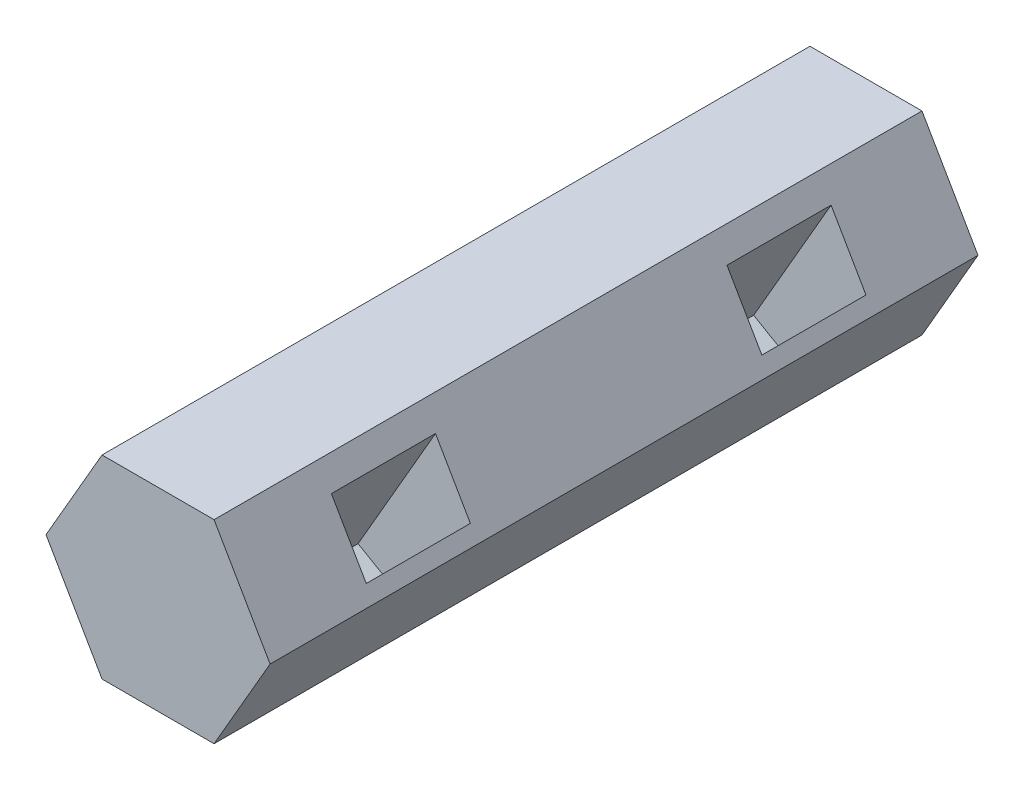
ISO-10303-21;
HEADER;
FILE_DESCRIPTION(('STEP AP214'),'2;1');
FILE_NAME('part.step','',(''),(''),'','','');
FILE_SCHEMA(('AUTOMOTIVE_DESIGN { 1 0 10303 214 1 1 1 1 }'));
ENDSEC;
DATA;
#1=APPLICATION_CONTEXT('core data for automotive mechanical design processes');
#2=APPLICATION_PROTOCOL_DEFINITION('international standard','automotive_design',2000,#1);
#3=PRODUCT_CONTEXT('',#1,'mechanical');
#4=PRODUCT('Part','Part','',(#3));
#5=PRODUCT_RELATED_PRODUCT_CATEGORY('part','',(#4));
#6=PRODUCT_DEFINITION_FORMATION('','',#4);
#7=PRODUCT_DEFINITION_CONTEXT('part definition',#1,'design');
#8=PRODUCT_DEFINITION('design','',#6,#7);
#9=PRODUCT_DEFINITION_SHAPE('','',#8);
#10=(LENGTH_UNIT() NAMED_UNIT(*) SI_UNIT(.MILLI.,.METRE.));
#11=(NAMED_UNIT(*) PLANE_ANGLE_UNIT() SI_UNIT($,.RADIAN.));
#12=(NAMED_UNIT(*) SI_UNIT($,.STERADIAN.) SOLID_ANGLE_UNIT());
#13=UNCERTAINTY_MEASURE_WITH_UNIT(LENGTH_MEASURE(1.E-05),#10,'distance_accuracy_value','');
#14=(GEOMETRIC_REPRESENTATION_CONTEXT(3) GLOBAL_UNCERTAINTY_ASSIGNED_CONTEXT((#13)) GLOBAL_UNIT_ASSIGNED_CONTEXT((#10,
#11,#12)) REPRESENTATION_CONTEXT('',''));
#15=CARTESIAN_POINT('',(0.,0.,0.));
#16=DIRECTION('',(0.,0.,1.));
#17=DIRECTION('',(1.,0.,0.));
#18=AXIS2_PLACEMENT_3D('',#15,#16,#17);
#19=CARTESIAN_POINT('',(2.6905989232415,4.66025403784439,34.));
#20=DIRECTION('',(0.,-1.,0.));
#21=DIRECTION('',(0.,0.,-1.));
#22=AXIS2_PLACEMENT_3D('',#19,#20,#21);
#23=PLANE('',#22);
#24=DIRECTION('',(-1.,0.,0.));
#25=VECTOR('',#24,1.);
#26=CARTESIAN_POINT('',(2.6905989232415,4.66025403784439,0.));
#27=LINE('',#26,#25);
#28=CARTESIAN_POINT('',(2.6905989232415,4.66025403784439,0.));
#29=VERTEX_POINT('',#28);
#30=CARTESIAN_POINT('',(-2.6905989232415,4.66025403784439,0.));
#31=VERTEX_POINT('',#30);
#32=EDGE_CURVE('E181',#29,#31,#27,.T.);
#33=ORIENTED_EDGE('',*,*,#32,.T.);
#34=DIRECTION('',(0.,0.,-1.));
#35=VECTOR('',#34,1.);
#36=CARTESIAN_POINT('',(-2.6905989232415,4.66025403784439,34.));
#37=LINE('',#36,#35);
#38=CARTESIAN_POINT('',(-2.6905989232415,4.66025403784439,34.));
#39=VERTEX_POINT('',#38);
#40=EDGE_CURVE('E222',#39,#31,#37,.T.);
#41=ORIENTED_EDGE('',*,*,#40,.F.);
#42=DIRECTION('',(-1.,0.,0.));
#43=VECTOR('',#42,1.);
#44=CARTESIAN_POINT('',(2.6905989232415,4.66025403784439,34.));
#45=LINE('',#44,#43);
#46=CARTESIAN_POINT('',(2.6905989232415,4.66025403784439,34.));
#47=VERTEX_POINT('',#46);
#48=EDGE_CURVE('E182',#47,#39,#45,.T.);
#49=ORIENTED_EDGE('',*,*,#48,.F.);
#50=DIRECTION('',(0.,0.,-1.));
#51=VECTOR('',#50,1.);
#52=CARTESIAN_POINT('',(2.6905989232415,4.66025403784439,34.));
#53=LINE('',#52,#51);
#54=EDGE_CURVE('E196',#47,#29,#53,.T.);
#55=ORIENTED_EDGE('',*,*,#54,.T.);
#56=EDGE_LOOP('',(#33,#41,#49,#55));
#57=FACE_BOUND('',#56,.T.);
#58=ADVANCED_FACE('F33',(#57),#23,.F.);
#59=CARTESIAN_POINT('',(-2.6905989232415,4.66025403784439,34.));
#60=DIRECTION('',(0.866025403784439,-0.5,0.));
#61=DIRECTION('',(0.5,0.866025403784439,0.));
#62=AXIS2_PLACEMENT_3D('',#59,#60,#61);
#63=PLANE('',#62);
#64=DIRECTION('',(-0.5,-0.866025403784439,0.));
#65=VECTOR('',#64,1.);
#66=CARTESIAN_POINT('',(-2.6905989232415,4.66025403784439,0.));
#67=LINE('',#66,#65);
#68=CARTESIAN_POINT('',(-5.38119784648299,0.,0.));
#69=VERTEX_POINT('',#68);
#70=EDGE_CURVE('E199',#31,#69,#67,.T.);
#71=ORIENTED_EDGE('',*,*,#70,.T.);
#72=DIRECTION('',(0.,0.,-1.));
#73=VECTOR('',#72,1.);
#74=CARTESIAN_POINT('',(-5.38119784648299,0.,34.));
#75=LINE('',#74,#73);
#76=CARTESIAN_POINT('',(-5.38119784648299,0.,34.));
#77=VERTEX_POINT('',#76);
#78=EDGE_CURVE('E219',#77,#69,#75,.T.);
#79=ORIENTED_EDGE('',*,*,#78,.F.);
#80=DIRECTION('',(-0.5,-0.866025403784439,0.));
#81=VECTOR('',#80,1.);
#82=CARTESIAN_POINT('',(-2.6905989232415,4.66025403784439,34.));
#83=LINE('',#82,#81);
#84=EDGE_CURVE('E185',#39,#77,#83,.T.);
#85=ORIENTED_EDGE('',*,*,#84,.F.);
#86=ORIENTED_EDGE('',*,*,#40,.T.);
#87=EDGE_LOOP('',(#71,#79,#85,#86));
#88=FACE_BOUND('',#87,.T.);
#89=ADVANCED_FACE('F255',(#88),#63,.F.);
#90=CARTESIAN_POINT('',(-5.38119784648299,0.,34.));
#91=DIRECTION('',(0.866025403784439,0.5,0.));
#92=DIRECTION('',(-0.5,0.866025403784438,0.));
#93=AXIS2_PLACEMENT_3D('',#90,#91,#92);
#94=PLANE('',#93);
#95=DIRECTION('',(0.5,-0.866025403784438,0.));
#96=VECTOR('',#95,1.);
#97=CARTESIAN_POINT('',(-5.38119784648299,0.,0.));
#98=LINE('',#97,#96);
#99=CARTESIAN_POINT('',(-2.69059892324149,-4.66025403784439,0.));
#100=VERTEX_POINT('',#99);
#101=EDGE_CURVE('E201',#69,#100,#98,.T.);
#102=ORIENTED_EDGE('',*,*,#101,.T.);
#103=DIRECTION('',(0.,0.,-1.));
#104=VECTOR('',#103,1.);
#105=CARTESIAN_POINT('',(-2.69059892324149,-4.66025403784439,34.));
#106=LINE('',#105,#104);
#107=CARTESIAN_POINT('',(-2.69059892324149,-4.66025403784439,34.));
#108=VERTEX_POINT('',#107);
#109=EDGE_CURVE('E216',#108,#100,#106,.T.);
#110=ORIENTED_EDGE('',*,*,#109,.F.);
#111=DIRECTION('',(0.5,-0.866025403784438,0.));
#112=VECTOR('',#111,1.);
#113=CARTESIAN_POINT('',(-5.38119784648299,0.,34.));
#114=LINE('',#113,#112);
#115=EDGE_CURVE('E188',#77,#108,#114,.T.);
#116=ORIENTED_EDGE('',*,*,#115,.F.);
#117=ORIENTED_EDGE('',*,*,#78,.T.);
#118=EDGE_LOOP('',(#102,#110,#116,#117));
#119=FACE_BOUND('',#118,.T.);
#120=ADVANCED_FACE('F260',(#119),#94,.F.);
#121=CARTESIAN_POINT('',(-2.69059892324149,-4.66025403784439,34.));
#122=DIRECTION('',(0.,1.,0.));
#123=DIRECTION('',(0.,0.,1.));
#124=AXIS2_PLACEMENT_3D('',#121,#122,#123);
#125=PLANE('',#124);
#126=DIRECTION('',(1.,0.,0.));
#127=VECTOR('',#126,1.);
#128=CARTESIAN_POINT('',(-2.69059892324149,-4.66025403784439,0.));
#129=LINE('',#128,#127);
#130=CARTESIAN_POINT('',(2.6905989232415,-4.66025403784439,0.));
#131=VERTEX_POINT('',#130);
#132=EDGE_CURVE('E203',#100,#131,#129,.T.);
#133=ORIENTED_EDGE('',*,*,#132,.T.);
#134=DIRECTION('',(0.,0.,-1.));
#135=VECTOR('',#134,1.);
#136=CARTESIAN_POINT('',(2.6905989232415,-4.66025403784439,34.));
#137=LINE('',#136,#135);
#138=CARTESIAN_POINT('',(2.6905989232415,-4.66025403784439,34.));
#139=VERTEX_POINT('',#138);
#140=EDGE_CURVE('E213',#139,#131,#137,.T.);
#141=ORIENTED_EDGE('',*,*,#140,.F.);
#142=DIRECTION('',(1.,0.,0.));
#143=VECTOR('',#142,1.);
#144=CARTESIAN_POINT('',(-2.69059892324149,-4.66025403784439,34.));
#145=LINE('',#144,#143);
#146=EDGE_CURVE('E190',#108,#139,#145,.T.);
#147=ORIENTED_EDGE('',*,*,#146,.F.);
#148=ORIENTED_EDGE('',*,*,#109,.T.);
#149=EDGE_LOOP('',(#133,#141,#147,#148));
#150=FACE_BOUND('',#149,.T.);
#151=ADVANCED_FACE('F284',(#150),#125,.F.);
#152=CARTESIAN_POINT('',(2.6905989232415,-4.66025403784439,34.));
#153=DIRECTION('',(-0.866025403784439,0.5,0.));
#154=DIRECTION('',(-0.5,-0.866025403784439,0.));
#155=AXIS2_PLACEMENT_3D('',#152,#153,#154);
#156=PLANE('',#155);
#157=DIRECTION('',(0.5,0.866025403784439,0.));
#158=VECTOR('',#157,1.);
#159=CARTESIAN_POINT('',(2.6905989232415,-4.66025403784439,0.));
#160=LINE('',#159,#158);
#161=CARTESIAN_POINT('',(5.381197846483,0.,0.));
#162=VERTEX_POINT('',#161);
#163=EDGE_CURVE('E205',#131,#162,#160,.T.);
#164=ORIENTED_EDGE('',*,*,#163,.T.);
#165=DIRECTION('',(0.,0.,-1.));
#166=VECTOR('',#165,1.);
#167=CARTESIAN_POINT('',(5.381197846483,0.,34.));
#168=LINE('',#167,#166);
#169=CARTESIAN_POINT('',(5.381197846483,0.,34.));
#170=VERTEX_POINT('',#169);
#171=EDGE_CURVE('E210',#170,#162,#168,.T.);
#172=ORIENTED_EDGE('',*,*,#171,.F.);
#173=DIRECTION('',(0.5,0.866025403784439,0.));
#174=VECTOR('',#173,1.);
#175=CARTESIAN_POINT('',(2.6905989232415,-4.66025403784439,34.));
#176=LINE('',#175,#174);
#177=EDGE_CURVE('E192',#139,#170,#176,.T.);
#178=ORIENTED_EDGE('',*,*,#177,.F.);
#179=ORIENTED_EDGE('',*,*,#140,.T.);
#180=EDGE_LOOP('',(#164,#172,#178,#179));
#181=FACE_BOUND('',#180,.T.);
#182=ADVANCED_FACE('F281',(#181),#156,.F.);
#183=CARTESIAN_POINT('',(5.381197846483,0.,34.));
#184=DIRECTION('',(-0.866025403784439,-0.5,0.));
#185=DIRECTION('',(0.5,-0.866025403784438,0.));
#186=AXIS2_PLACEMENT_3D('',#183,#184,#185);
#187=PLANE('',#186);
#188=DIRECTION('',(0.,0.,-1.));
#189=VECTOR('',#188,1.);
#190=CARTESIAN_POINT('',(3.32568421935009,3.56025403784439,34.));
#191=LINE('',#190,#189);
#192=CARTESIAN_POINT('',(3.32568421935009,3.56025403784439,29.));
#193=VERTEX_POINT('',#192);
#194=CARTESIAN_POINT('',(3.32568421935009,3.56025403784439,24.));
#195=VERTEX_POINT('',#194);
#196=EDGE_CURVE('E236',#193,#195,#191,.T.);
#197=ORIENTED_EDGE('',*,*,#196,.T.);
#198=DIRECTION('',(0.5,-0.866025403784438,0.));
#199=VECTOR('',#198,1.);
#200=CARTESIAN_POINT('',(5.381197846483,0.,24.));
#201=LINE('',#200,#199);
#202=CARTESIAN_POINT('',(5.,0.660254037844389,24.));
#203=VERTEX_POINT('',#202);
#204=EDGE_CURVE('E11',#195,#203,#201,.T.);
#205=ORIENTED_EDGE('',*,*,#204,.T.);
#206=DIRECTION('',(0.,0.,1.));
#207=VECTOR('',#206,1.);
#208=CARTESIAN_POINT('',(5.,0.660254037844388,34.));
#209=LINE('',#208,#207);
#210=CARTESIAN_POINT('',(5.,0.660254037844389,29.));
#211=VERTEX_POINT('',#210);
#212=EDGE_CURVE('E40',#203,#211,#209,.T.);
#213=ORIENTED_EDGE('',*,*,#212,.T.);
#214=DIRECTION('',(0.5,-0.866025403784438,0.));
#215=VECTOR('',#214,1.);
#216=CARTESIAN_POINT('',(5.381197846483,0.,29.));
#217=LINE('',#216,#215);
#218=EDGE_CURVE('E234',#193,#211,#217,.T.);
#219=ORIENTED_EDGE('',*,*,#218,.F.);
#220=EDGE_LOOP('',(#197,#205,#213,#219));
#221=FACE_BOUND('',#220,.T.);
#222=DIRECTION('',(0.,0.,-1.));
#223=VECTOR('',#222,1.);
#224=CARTESIAN_POINT('',(5.,0.660254037844388,34.));
#225=LINE('',#224,#223);
#226=CARTESIAN_POINT('',(5.,0.660254037844389,10.));
#227=VERTEX_POINT('',#226);
#228=CARTESIAN_POINT('',(5.,0.660254037844389,5.));
#229=VERTEX_POINT('',#228);
#230=EDGE_CURVE('E227',#227,#229,#225,.T.);
#231=ORIENTED_EDGE('',*,*,#230,.F.);
#232=DIRECTION('',(-0.5,0.866025403784438,0.));
#233=VECTOR('',#232,1.);
#234=CARTESIAN_POINT('',(5.381197846483,0.,10.));
#235=LINE('',#234,#233);
#236=CARTESIAN_POINT('',(3.32568421935009,3.56025403784439,10.));
#237=VERTEX_POINT('',#236);
#238=EDGE_CURVE('E231',#227,#237,#235,.T.);
#239=ORIENTED_EDGE('',*,*,#238,.T.);
#240=DIRECTION('',(0.,0.,1.));
#241=VECTOR('',#240,1.);
#242=CARTESIAN_POINT('',(3.32568421935009,3.56025403784439,34.));
#243=LINE('',#242,#241);
#244=CARTESIAN_POINT('',(3.32568421935009,3.56025403784439,5.));
#245=VERTEX_POINT('',#244);
#246=EDGE_CURVE('E229',#245,#237,#243,.T.);
#247=ORIENTED_EDGE('',*,*,#246,.F.);
#248=DIRECTION('',(-0.5,0.866025403784438,0.));
#249=VECTOR('',#248,1.);
#250=CARTESIAN_POINT('',(5.381197846483,0.,5.));
#251=LINE('',#250,#249);
#252=EDGE_CURVE('E225',#229,#245,#251,.T.);
#253=ORIENTED_EDGE('',*,*,#252,.F.);
#254=EDGE_LOOP('',(#231,#239,#247,#253));
#255=FACE_BOUND('',#254,.T.);
#256=DIRECTION('',(-0.5,0.866025403784438,0.));
#257=VECTOR('',#256,1.);
#258=CARTESIAN_POINT('',(5.381197846483,0.,0.));
#259=LINE('',#258,#257);
#260=EDGE_CURVE('E186',#162,#29,#259,.T.);
#261=ORIENTED_EDGE('',*,*,#260,.T.);
#262=ORIENTED_EDGE('',*,*,#54,.F.);
#263=DIRECTION('',(-0.5,0.866025403784438,0.));
#264=VECTOR('',#263,1.);
#265=CARTESIAN_POINT('',(5.381197846483,0.,34.));
#266=LINE('',#265,#264);
#267=EDGE_CURVE('E194',#170,#47,#266,.T.);
#268=ORIENTED_EDGE('',*,*,#267,.F.);
#269=ORIENTED_EDGE('',*,*,#171,.T.);
#270=EDGE_LOOP('',(#261,#262,#268,#269));
#271=FACE_BOUND('',#270,.T.);
#272=ADVANCED_FACE('F240',(#221,#255,#271),#187,.F.);
#273=CARTESIAN_POINT('',(0.,0.,34.));
#274=DIRECTION('',(0.,0.,1.));
#275=DIRECTION('',(1.,0.,0.));
#276=AXIS2_PLACEMENT_3D('',#273,#274,#275);
#277=PLANE('',#276);
#278=ORIENTED_EDGE('',*,*,#48,.T.);
#279=ORIENTED_EDGE('',*,*,#84,.T.);
#280=ORIENTED_EDGE('',*,*,#115,.T.);
#281=ORIENTED_EDGE('',*,*,#146,.T.);
#282=ORIENTED_EDGE('',*,*,#177,.T.);
#283=ORIENTED_EDGE('',*,*,#267,.T.);
#284=EDGE_LOOP('',(#278,#279,#280,#281,#282,#283));
#285=FACE_BOUND('',#284,.T.);
#286=ADVANCED_FACE('F275',(#285),#277,.T.);
#287=CARTESIAN_POINT('',(0.,0.,0.));
#288=DIRECTION('',(0.,0.,1.));
#289=DIRECTION('',(1.,0.,0.));
#290=AXIS2_PLACEMENT_3D('',#287,#288,#289);
#291=PLANE('',#290);
#292=ORIENTED_EDGE('',*,*,#32,.F.);
#293=ORIENTED_EDGE('',*,*,#260,.F.);
#294=ORIENTED_EDGE('',*,*,#163,.F.);
#295=ORIENTED_EDGE('',*,*,#132,.F.);
#296=ORIENTED_EDGE('',*,*,#101,.F.);
#297=ORIENTED_EDGE('',*,*,#70,.F.);
#298=EDGE_LOOP('',(#292,#293,#294,#295,#296,#297));
#299=FACE_BOUND('',#298,.T.);
#300=ADVANCED_FACE('F268',(#299),#291,.F.);
#301=CARTESIAN_POINT('',(3.65731917233135,4.13466262597365,10.));
#302=DIRECTION('',(0.866025403784439,-0.5,0.));
#303=DIRECTION('',(0.5,0.866025403784439,0.));
#304=AXIS2_PLACEMENT_3D('',#301,#302,#303);
#305=PLANE('',#304);
#306=ORIENTED_EDGE('',*,*,#246,.T.);
#307=DIRECTION('',(-0.5,-0.866025403784439,0.));
#308=VECTOR('',#307,1.);
#309=CARTESIAN_POINT('',(3.65731917233135,4.13466262597365,10.));
#310=LINE('',#309,#308);
#311=CARTESIAN_POINT('',(-0.392671517457867,-2.88012701892219,10.));
#312=VERTEX_POINT('',#311);
#313=EDGE_CURVE('E164',#237,#312,#310,.T.);
#314=ORIENTED_EDGE('',*,*,#313,.T.);
#315=DIRECTION('',(0.,0.,-1.));
#316=VECTOR('',#315,1.);
#317=CARTESIAN_POINT('',(-0.392671517457867,-2.88012701892219,10.));
#318=LINE('',#317,#316);
#319=CARTESIAN_POINT('',(-0.392671517457867,-2.88012701892219,5.));
#320=VERTEX_POINT('',#319);
#321=EDGE_CURVE('E178',#312,#320,#318,.T.);
#322=ORIENTED_EDGE('',*,*,#321,.T.);
#323=DIRECTION('',(-0.5,-0.866025403784439,0.));
#324=VECTOR('',#323,1.);
#325=CARTESIAN_POINT('',(3.65731917233135,4.13466262597365,5.));
#326=LINE('',#325,#324);
#327=EDGE_CURVE('E143',#245,#320,#326,.T.);
#328=ORIENTED_EDGE('',*,*,#327,.F.);
#329=EDGE_LOOP('',(#306,#314,#322,#328));
#330=FACE_BOUND('',#329,.T.);
#331=ADVANCED_FACE('F301',(#330),#305,.T.);
#332=CARTESIAN_POINT('',(2.11880215351701,-4.33012701892219,10.));
#333=DIRECTION('',(-0.866025403784439,0.5,0.));
#334=DIRECTION('',(-0.5,-0.866025403784439,0.));
#335=AXIS2_PLACEMENT_3D('',#332,#333,#334);
#336=PLANE('',#335);
#337=ORIENTED_EDGE('',*,*,#230,.T.);
#338=DIRECTION('',(0.5,0.866025403784439,0.));
#339=VECTOR('',#338,1.);
#340=CARTESIAN_POINT('',(2.11880215351701,-4.33012701892219,5.));
#341=LINE('',#340,#339);
#342=CARTESIAN_POINT('',(2.11880215351701,-4.33012701892219,5.));
#343=VERTEX_POINT('',#342);
#344=EDGE_CURVE('E55',#343,#229,#341,.T.);
#345=ORIENTED_EDGE('',*,*,#344,.F.);
#346=DIRECTION('',(0.,0.,-1.));
#347=VECTOR('',#346,1.);
#348=CARTESIAN_POINT('',(2.11880215351701,-4.33012701892219,10.));
#349=LINE('',#348,#347);
#350=CARTESIAN_POINT('',(2.11880215351701,-4.33012701892219,10.));
#351=VERTEX_POINT('',#350);
#352=EDGE_CURVE('E171',#351,#343,#349,.T.);
#353=ORIENTED_EDGE('',*,*,#352,.F.);
#354=DIRECTION('',(0.5,0.866025403784439,0.));
#355=VECTOR('',#354,1.);
#356=CARTESIAN_POINT('',(2.11880215351701,-4.33012701892219,10.));
#357=LINE('',#356,#355);
#358=EDGE_CURVE('E168',#351,#227,#357,.T.);
#359=ORIENTED_EDGE('',*,*,#358,.T.);
#360=EDGE_LOOP('',(#337,#345,#353,#359));
#361=FACE_BOUND('',#360,.T.);
#362=ADVANCED_FACE('F306',(#361),#336,.T.);
#363=CARTESIAN_POINT('',(0.,0.,10.));
#364=DIRECTION('',(0.,0.,1.));
#365=DIRECTION('',(1.,0.,0.));
#366=AXIS2_PLACEMENT_3D('',#363,#364,#365);
#367=PLANE('',#366);
#368=ORIENTED_EDGE('',*,*,#358,.F.);
#369=DIRECTION('',(0.866025403784439,-0.5,0.));
#370=VECTOR('',#369,1.);
#371=CARTESIAN_POINT('',(-0.392671517457867,-2.88012701892219,10.));
#372=LINE('',#371,#370);
#373=EDGE_CURVE('E166',#312,#351,#372,.T.);
#374=ORIENTED_EDGE('',*,*,#373,.F.);
#375=ORIENTED_EDGE('',*,*,#313,.F.);
#376=ORIENTED_EDGE('',*,*,#238,.F.);
#377=EDGE_LOOP('',(#368,#374,#375,#376));
#378=FACE_BOUND('',#377,.T.);
#379=ADVANCED_FACE('F315',(#378),#367,.F.);
#380=CARTESIAN_POINT('',(0.,0.,5.));
#381=DIRECTION('',(0.,0.,1.));
#382=DIRECTION('',(1.,0.,0.));
#383=AXIS2_PLACEMENT_3D('',#380,#381,#382);
#384=PLANE('',#383);
#385=ORIENTED_EDGE('',*,*,#252,.T.);
#386=ORIENTED_EDGE('',*,*,#327,.T.);
#387=DIRECTION('',(0.866025403784439,-0.5,0.));
#388=VECTOR('',#387,1.);
#389=CARTESIAN_POINT('',(-0.392671517457867,-2.88012701892219,5.));
#390=LINE('',#389,#388);
#391=EDGE_CURVE('E173',#320,#343,#390,.T.);
#392=ORIENTED_EDGE('',*,*,#391,.T.);
#393=ORIENTED_EDGE('',*,*,#344,.T.);
#394=EDGE_LOOP('',(#385,#386,#392,#393));
#395=FACE_BOUND('',#394,.T.);
#396=ADVANCED_FACE('F311',(#395),#384,.T.);
#397=CARTESIAN_POINT('',(-0.392671517457867,-2.88012701892219,10.));
#398=DIRECTION('',(0.5,0.866025403784439,0.));
#399=DIRECTION('',(-0.866025403784439,0.5,0.));
#400=AXIS2_PLACEMENT_3D('',#397,#398,#399);
#401=PLANE('',#400);
#402=ORIENTED_EDGE('',*,*,#391,.F.);
#403=ORIENTED_EDGE('',*,*,#321,.F.);
#404=ORIENTED_EDGE('',*,*,#373,.T.);
#405=ORIENTED_EDGE('',*,*,#352,.T.);
#406=EDGE_LOOP('',(#402,#403,#404,#405));
#407=FACE_BOUND('',#406,.T.);
#408=ADVANCED_FACE('F308',(#407),#401,.T.);
#409=CARTESIAN_POINT('',(2.11880215351701,-4.33012701892219,24.));
#410=DIRECTION('',(0.866025403784439,-0.5,0.));
#411=DIRECTION('',(0.5,0.866025403784439,0.));
#412=AXIS2_PLACEMENT_3D('',#409,#410,#411);
#413=PLANE('',#412);
#414=DIRECTION('',(0.5,0.866025403784439,0.));
#415=VECTOR('',#414,1.);
#416=CARTESIAN_POINT('',(2.11880215351701,-4.33012701892219,24.));
#417=LINE('',#416,#415);
#418=CARTESIAN_POINT('',(2.11880215351701,-4.33012701892219,24.));
#419=VERTEX_POINT('',#418);
#420=EDGE_CURVE('E147',#419,#203,#417,.T.);
#421=ORIENTED_EDGE('',*,*,#420,.F.);
#422=DIRECTION('',(0.,0.,1.));
#423=VECTOR('',#422,1.);
#424=CARTESIAN_POINT('',(2.11880215351701,-4.33012701892219,24.));
#425=LINE('',#424,#423);
#426=CARTESIAN_POINT('',(2.11880215351701,-4.33012701892219,29.));
#427=VERTEX_POINT('',#426);
#428=EDGE_CURVE('E133',#419,#427,#425,.T.);
#429=ORIENTED_EDGE('',*,*,#428,.T.);
#430=DIRECTION('',(0.5,0.866025403784439,0.));
#431=VECTOR('',#430,1.);
#432=CARTESIAN_POINT('',(2.11880215351701,-4.33012701892219,29.));
#433=LINE('',#432,#431);
#434=EDGE_CURVE('E159',#427,#211,#433,.T.);
#435=ORIENTED_EDGE('',*,*,#434,.T.);
#436=ORIENTED_EDGE('',*,*,#212,.F.);
#437=EDGE_LOOP('',(#421,#429,#435,#436));
#438=FACE_BOUND('',#437,.T.);
#439=ADVANCED_FACE('F148',(#438),#413,.F.);
#440=CARTESIAN_POINT('',(3.65731917233135,4.13466262597365,24.));
#441=DIRECTION('',(-0.866025403784439,0.5,0.));
#442=DIRECTION('',(-0.5,-0.866025403784439,0.));
#443=AXIS2_PLACEMENT_3D('',#440,#441,#442);
#444=PLANE('',#443);
#445=DIRECTION('',(-0.5,-0.866025403784439,0.));
#446=VECTOR('',#445,1.);
#447=CARTESIAN_POINT('',(3.65731917233135,4.13466262597365,29.));
#448=LINE('',#447,#446);
#449=CARTESIAN_POINT('',(-0.392671517457867,-2.88012701892219,29.));
#450=VERTEX_POINT('',#449);
#451=EDGE_CURVE('E47',#193,#450,#448,.T.);
#452=ORIENTED_EDGE('',*,*,#451,.T.);
#453=DIRECTION('',(0.,0.,1.));
#454=VECTOR('',#453,1.);
#455=CARTESIAN_POINT('',(-0.392671517457867,-2.88012701892219,24.));
#456=LINE('',#455,#454);
#457=CARTESIAN_POINT('',(-0.392671517457867,-2.88012701892219,24.));
#458=VERTEX_POINT('',#457);
#459=EDGE_CURVE('E144',#458,#450,#456,.T.);
#460=ORIENTED_EDGE('',*,*,#459,.F.);
#461=DIRECTION('',(-0.5,-0.866025403784439,0.));
#462=VECTOR('',#461,1.);
#463=CARTESIAN_POINT('',(3.65731917233135,4.13466262597365,24.));
#464=LINE('',#463,#462);
#465=EDGE_CURVE('E154',#195,#458,#464,.T.);
#466=ORIENTED_EDGE('',*,*,#465,.F.);
#467=ORIENTED_EDGE('',*,*,#196,.F.);
#468=EDGE_LOOP('',(#452,#460,#466,#467));
#469=FACE_BOUND('',#468,.T.);
#470=ADVANCED_FACE('F243',(#469),#444,.F.);
#471=CARTESIAN_POINT('',(0.,0.,24.));
#472=DIRECTION('',(0.,0.,-1.));
#473=DIRECTION('',(1.,0.,0.));
#474=AXIS2_PLACEMENT_3D('',#471,#472,#473);
#475=PLANE('',#474);
#476=ORIENTED_EDGE('',*,*,#465,.T.);
#477=DIRECTION('',(0.866025403784439,-0.5,0.));
#478=VECTOR('',#477,1.);
#479=CARTESIAN_POINT('',(-0.392671517457867,-2.88012701892219,24.));
#480=LINE('',#479,#478);
#481=EDGE_CURVE('E138',#458,#419,#480,.T.);
#482=ORIENTED_EDGE('',*,*,#481,.T.);
#483=ORIENTED_EDGE('',*,*,#420,.T.);
#484=ORIENTED_EDGE('',*,*,#204,.F.);
#485=EDGE_LOOP('',(#476,#482,#483,#484));
#486=FACE_BOUND('',#485,.T.);
#487=ADVANCED_FACE('F152',(#486),#475,.F.);
#488=CARTESIAN_POINT('',(0.,0.,29.));
#489=DIRECTION('',(0.,0.,-1.));
#490=DIRECTION('',(1.,0.,0.));
#491=AXIS2_PLACEMENT_3D('',#488,#489,#490);
#492=PLANE('',#491);
#493=ORIENTED_EDGE('',*,*,#218,.T.);
#494=ORIENTED_EDGE('',*,*,#434,.F.);
#495=DIRECTION('',(0.866025403784439,-0.5,0.));
#496=VECTOR('',#495,1.);
#497=CARTESIAN_POINT('',(-0.392671517457867,-2.88012701892219,29.));
#498=LINE('',#497,#496);
#499=EDGE_CURVE('E139',#450,#427,#498,.T.);
#500=ORIENTED_EDGE('',*,*,#499,.F.);
#501=ORIENTED_EDGE('',*,*,#451,.F.);
#502=EDGE_LOOP('',(#493,#494,#500,#501));
#503=FACE_BOUND('',#502,.T.);
#504=ADVANCED_FACE('F244',(#503),#492,.T.);
#505=CARTESIAN_POINT('',(-0.392671517457867,-2.88012701892219,24.));
#506=DIRECTION('',(-0.5,-0.866025403784439,0.));
#507=DIRECTION('',(0.866025403784439,-0.5,0.));
#508=AXIS2_PLACEMENT_3D('',#505,#506,#507);
#509=PLANE('',#508);
#510=ORIENTED_EDGE('',*,*,#499,.T.);
#511=ORIENTED_EDGE('',*,*,#428,.F.);
#512=ORIENTED_EDGE('',*,*,#481,.F.);
#513=ORIENTED_EDGE('',*,*,#459,.T.);
#514=EDGE_LOOP('',(#510,#511,#512,#513));
#515=FACE_BOUND('',#514,.T.);
#516=ADVANCED_FACE('F135',(#515),#509,.F.);
#517=CLOSED_SHELL('',(#58,#89,#120,#151,#182,#272,#286,#300,#331,#362,#379,#396,#408,#439,#470,
#487,#504,#516));
#518=MANIFOLD_SOLID_BREP('B2',#517);
#519=ADVANCED_BREP_SHAPE_REPRESENTATION('',(#18,#518),#14);
#520=SHAPE_DEFINITION_REPRESENTATION(#9,#519);
ENDSEC;
END-ISO-10303-21;
